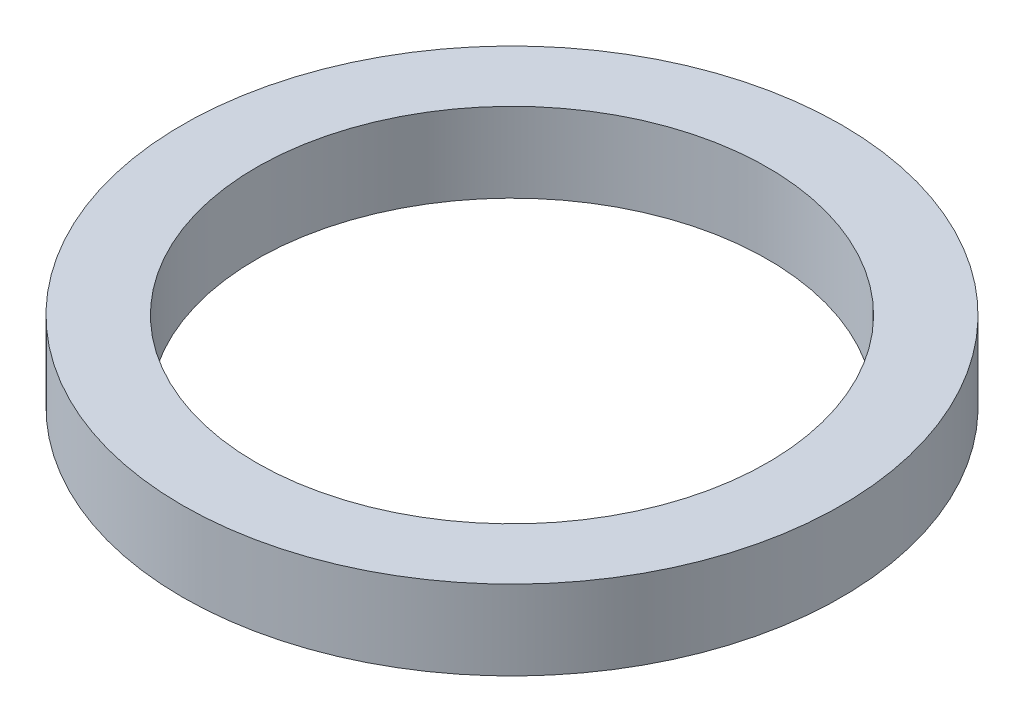
ISO-10303-21;
HEADER;
FILE_DESCRIPTION(('STEP AP214'),'2;1');
FILE_NAME('part.step','',(''),(''),'','','');
FILE_SCHEMA(('AUTOMOTIVE_DESIGN { 1 0 10303 214 1 1 1 1 }'));
ENDSEC;
DATA;
#1=APPLICATION_CONTEXT('core data for automotive mechanical design processes');
#2=APPLICATION_PROTOCOL_DEFINITION('international standard','automotive_design',2000,#1);
#3=PRODUCT_CONTEXT('',#1,'mechanical');
#4=PRODUCT('Part','Part','',(#3));
#5=PRODUCT_RELATED_PRODUCT_CATEGORY('part','',(#4));
#6=PRODUCT_DEFINITION_FORMATION('','',#4);
#7=PRODUCT_DEFINITION_CONTEXT('part definition',#1,'design');
#8=PRODUCT_DEFINITION('design','',#6,#7);
#9=PRODUCT_DEFINITION_SHAPE('','',#8);
#10=(LENGTH_UNIT() NAMED_UNIT(*) SI_UNIT(.MILLI.,.METRE.));
#11=(NAMED_UNIT(*) PLANE_ANGLE_UNIT() SI_UNIT($,.RADIAN.));
#12=(NAMED_UNIT(*) SI_UNIT($,.STERADIAN.) SOLID_ANGLE_UNIT());
#13=UNCERTAINTY_MEASURE_WITH_UNIT(LENGTH_MEASURE(1.E-05),#10,'distance_accuracy_value','');
#14=(GEOMETRIC_REPRESENTATION_CONTEXT(3) GLOBAL_UNCERTAINTY_ASSIGNED_CONTEXT((#13)) GLOBAL_UNIT_ASSIGNED_CONTEXT((#10,
#11,#12)) REPRESENTATION_CONTEXT('',''));
#15=CARTESIAN_POINT('',(0.,0.,0.));
#16=DIRECTION('',(0.,0.,1.));
#17=DIRECTION('',(1.,0.,0.));
#18=AXIS2_PLACEMENT_3D('',#15,#16,#17);
#19=CARTESIAN_POINT('',(0.,7.,0.));
#20=DIRECTION('',(0.,1.,0.));
#21=DIRECTION('',(0.,0.,1.));
#22=AXIS2_PLACEMENT_3D('',#19,#20,#21);
#23=PLANE('',#22);
#24=CARTESIAN_POINT('',(0.,7.,0.));
#25=DIRECTION('',(0.,1.,0.));
#26=DIRECTION('',(0.,0.,1.));
#27=AXIS2_PLACEMENT_3D('',#24,#25,#26);
#28=CIRCLE('',#27,29.);
#29=CARTESIAN_POINT('',(0.,7.,29.));
#30=VERTEX_POINT('',#29);
#31=EDGE_CURVE('E10',#30,#30,#28,.T.);
#32=ORIENTED_EDGE('',*,*,#31,.T.);
#33=EDGE_LOOP('',(#32));
#34=FACE_BOUND('',#33,.T.);
#35=CARTESIAN_POINT('',(0.,7.,0.));
#36=DIRECTION('',(0.,1.,0.));
#37=DIRECTION('',(0.,0.,1.));
#38=AXIS2_PLACEMENT_3D('',#35,#36,#37);
#39=CIRCLE('',#38,22.5);
#40=CARTESIAN_POINT('',(0.,7.,22.5));
#41=VERTEX_POINT('',#40);
#42=EDGE_CURVE('E45',#41,#41,#39,.T.);
#43=ORIENTED_EDGE('',*,*,#42,.F.);
#44=EDGE_LOOP('',(#43));
#45=FACE_BOUND('',#44,.T.);
#46=ADVANCED_FACE('F34',(#34,#45),#23,.T.);
#47=CARTESIAN_POINT('',(0.,0.,0.));
#48=DIRECTION('',(0.,1.,0.));
#49=DIRECTION('',(0.,0.,1.));
#50=AXIS2_PLACEMENT_3D('',#47,#48,#49);
#51=PLANE('',#50);
#52=CARTESIAN_POINT('',(0.,0.,0.));
#53=DIRECTION('',(0.,1.,0.));
#54=DIRECTION('',(0.,0.,1.));
#55=AXIS2_PLACEMENT_3D('',#52,#53,#54);
#56=CIRCLE('',#55,29.);
#57=CARTESIAN_POINT('',(0.,0.,29.));
#58=VERTEX_POINT('',#57);
#59=EDGE_CURVE('E38',#58,#58,#56,.T.);
#60=ORIENTED_EDGE('',*,*,#59,.F.);
#61=EDGE_LOOP('',(#60));
#62=FACE_BOUND('',#61,.T.);
#63=CARTESIAN_POINT('',(0.,0.,0.));
#64=DIRECTION('',(0.,1.,0.));
#65=DIRECTION('',(0.,0.,1.));
#66=AXIS2_PLACEMENT_3D('',#63,#64,#65);
#67=CIRCLE('',#66,22.5);
#68=CARTESIAN_POINT('',(0.,0.,22.5));
#69=VERTEX_POINT('',#68);
#70=EDGE_CURVE('E47',#69,#69,#67,.T.);
#71=ORIENTED_EDGE('',*,*,#70,.T.);
#72=EDGE_LOOP('',(#71));
#73=FACE_BOUND('',#72,.T.);
#74=ADVANCED_FACE('F57',(#62,#73),#51,.F.);
#75=CARTESIAN_POINT('',(0.,7.,0.));
#76=DIRECTION('',(0.,-1.,0.));
#77=DIRECTION('',(0.,0.,-1.));
#78=AXIS2_PLACEMENT_3D('',#75,#76,#77);
#79=CYLINDRICAL_SURFACE('',#78,29.);
#80=ORIENTED_EDGE('',*,*,#31,.F.);
#81=EDGE_LOOP('',(#80));
#82=FACE_BOUND('',#81,.T.);
#83=ORIENTED_EDGE('',*,*,#59,.T.);
#84=EDGE_LOOP('',(#83));
#85=FACE_BOUND('',#84,.T.);
#86=ADVANCED_FACE('F36',(#82,#85),#79,.T.);
#87=CARTESIAN_POINT('',(0.,7.,0.));
#88=DIRECTION('',(0.,-1.,0.));
#89=DIRECTION('',(0.,0.,-1.));
#90=AXIS2_PLACEMENT_3D('',#87,#88,#89);
#91=CYLINDRICAL_SURFACE('',#90,22.5);
#92=ORIENTED_EDGE('',*,*,#42,.T.);
#93=EDGE_LOOP('',(#92));
#94=FACE_BOUND('',#93,.T.);
#95=ORIENTED_EDGE('',*,*,#70,.F.);
#96=EDGE_LOOP('',(#95));
#97=FACE_BOUND('',#96,.T.);
#98=ADVANCED_FACE('F53',(#94,#97),#91,.F.);
#99=CLOSED_SHELL('',(#46,#74,#86,#98));
#100=MANIFOLD_SOLID_BREP('B2',#99);
#101=ADVANCED_BREP_SHAPE_REPRESENTATION('',(#18,#100),#14);
#102=SHAPE_DEFINITION_REPRESENTATION(#9,#101);
ENDSEC;
END-ISO-10303-21;
